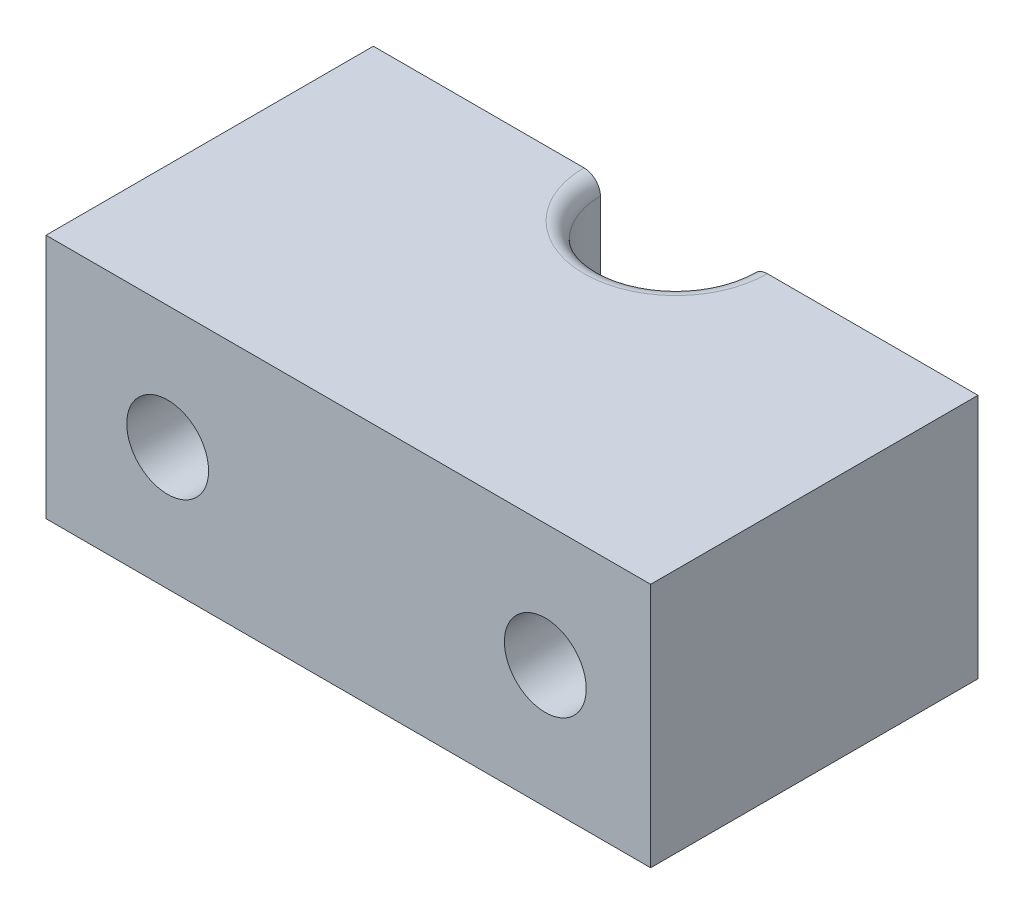
ISO-10303-21;
HEADER;
FILE_DESCRIPTION(('STEP AP214'),'2;1');
FILE_NAME('part.step','',(''),(''),'','','');
FILE_SCHEMA(('AUTOMOTIVE_DESIGN { 1 0 10303 214 1 1 1 1 }'));
ENDSEC;
DATA;
#1=APPLICATION_CONTEXT('core data for automotive mechanical design processes');
#2=APPLICATION_PROTOCOL_DEFINITION('international standard','automotive_design',2000,#1);
#3=PRODUCT_CONTEXT('',#1,'mechanical');
#4=PRODUCT('Part','Part','',(#3));
#5=PRODUCT_RELATED_PRODUCT_CATEGORY('part','',(#4));
#6=PRODUCT_DEFINITION_FORMATION('','',#4);
#7=PRODUCT_DEFINITION_CONTEXT('part definition',#1,'design');
#8=PRODUCT_DEFINITION('design','',#6,#7);
#9=PRODUCT_DEFINITION_SHAPE('','',#8);
#10=(LENGTH_UNIT() NAMED_UNIT(*) SI_UNIT(.MILLI.,.METRE.));
#11=(NAMED_UNIT(*) PLANE_ANGLE_UNIT() SI_UNIT($,.RADIAN.));
#12=(NAMED_UNIT(*) SI_UNIT($,.STERADIAN.) SOLID_ANGLE_UNIT());
#13=UNCERTAINTY_MEASURE_WITH_UNIT(LENGTH_MEASURE(1.E-05),#10,'distance_accuracy_value','');
#14=(GEOMETRIC_REPRESENTATION_CONTEXT(3) GLOBAL_UNCERTAINTY_ASSIGNED_CONTEXT((#13)) GLOBAL_UNIT_ASSIGNED_CONTEXT((#10,
#11,#12)) REPRESENTATION_CONTEXT('',''));
#15=CARTESIAN_POINT('',(0.,0.,0.));
#16=DIRECTION('',(0.,0.,1.));
#17=DIRECTION('',(1.,0.,0.));
#18=AXIS2_PLACEMENT_3D('',#15,#16,#17);
#19=CARTESIAN_POINT('',(125.,0.,-20.));
#20=DIRECTION('',(0.,0.,-1.));
#21=DIRECTION('',(-1.,0.,0.));
#22=AXIS2_PLACEMENT_3D('',#19,#20,#21);
#23=PLANE('',#22);
#24=DIRECTION('',(0.,1.,0.));
#25=VECTOR('',#24,1.);
#26=CARTESIAN_POINT('',(101.93,0.,-20.));
#27=LINE('',#26,#25);
#28=CARTESIAN_POINT('',(101.93,1.,-20.));
#29=VERTEX_POINT('',#28);
#30=CARTESIAN_POINT('',(101.93,14.,-20.));
#31=VERTEX_POINT('',#30);
#32=EDGE_CURVE('E170',#29,#31,#27,.T.);
#33=ORIENTED_EDGE('',*,*,#32,.F.);
#34=CARTESIAN_POINT('',(100.93,1.,-20.));
#35=DIRECTION('',(0.,0.,-1.));
#36=DIRECTION('',(-1.,0.,0.));
#37=AXIS2_PLACEMENT_3D('',#34,#35,#36);
#38=CIRCLE('',#37,1.);
#39=CARTESIAN_POINT('',(100.93,0.,-20.));
#40=VERTEX_POINT('',#39);
#41=EDGE_CURVE('E11',#29,#40,#38,.T.);
#42=ORIENTED_EDGE('',*,*,#41,.T.);
#43=DIRECTION('',(-1.,0.,0.));
#44=VECTOR('',#43,1.);
#45=CARTESIAN_POINT('',(125.,0.,-20.));
#46=LINE('',#45,#44);
#47=CARTESIAN_POINT('',(88.06,0.,-20.));
#48=VERTEX_POINT('',#47);
#49=EDGE_CURVE('E120',#40,#48,#46,.T.);
#50=ORIENTED_EDGE('',*,*,#49,.T.);
#51=DIRECTION('',(0.,1.,0.));
#52=VECTOR('',#51,1.);
#53=CARTESIAN_POINT('',(88.06,0.,-20.));
#54=LINE('',#53,#52);
#55=CARTESIAN_POINT('',(88.06,15.,-20.));
#56=VERTEX_POINT('',#55);
#57=EDGE_CURVE('E106',#48,#56,#54,.T.);
#58=ORIENTED_EDGE('',*,*,#57,.T.);
#59=DIRECTION('',(-1.,0.,0.));
#60=VECTOR('',#59,1.);
#61=CARTESIAN_POINT('',(125.,15.,-20.));
#62=LINE('',#61,#60);
#63=CARTESIAN_POINT('',(100.93,15.,-20.));
#64=VERTEX_POINT('',#63);
#65=EDGE_CURVE('E138',#64,#56,#62,.T.);
#66=ORIENTED_EDGE('',*,*,#65,.F.);
#67=CARTESIAN_POINT('',(100.93,14.,-20.));
#68=DIRECTION('',(0.,0.,-1.));
#69=DIRECTION('',(-1.,0.,0.));
#70=AXIS2_PLACEMENT_3D('',#67,#68,#69);
#71=CIRCLE('',#70,1.);
#72=EDGE_CURVE('E161',#64,#31,#71,.T.);
#73=ORIENTED_EDGE('',*,*,#72,.T.);
#74=EDGE_LOOP('',(#33,#42,#50,#58,#66,#73));
#75=FACE_BOUND('',#74,.T.);
#76=CARTESIAN_POINT('',(95.4916685270529,7.5,-20.));
#77=DIRECTION('',(0.,0.,-1.));
#78=DIRECTION('',(-1.,0.,0.));
#79=AXIS2_PLACEMENT_3D('',#76,#77,#78);
#80=CIRCLE('',#79,2.49999999999999);
#81=CARTESIAN_POINT('',(92.9916685270529,7.5,-20.));
#82=VERTEX_POINT('',#81);
#83=EDGE_CURVE('E139',#82,#82,#80,.T.);
#84=ORIENTED_EDGE('',*,*,#83,.F.);
#85=EDGE_LOOP('',(#84));
#86=FACE_BOUND('',#85,.T.);
#87=ADVANCED_FACE('F33',(#75,#86),#23,.T.);
#88=CARTESIAN_POINT('',(125.,0.,0.));
#89=DIRECTION('',(1.,0.,0.));
#90=DIRECTION('',(0.,0.,-1.));
#91=AXIS2_PLACEMENT_3D('',#88,#89,#90);
#92=PLANE('',#91);
#93=DIRECTION('',(0.,0.,-1.));
#94=VECTOR('',#93,1.);
#95=CARTESIAN_POINT('',(125.,15.,0.));
#96=LINE('',#95,#94);
#97=CARTESIAN_POINT('',(125.,15.,0.));
#98=VERTEX_POINT('',#97);
#99=CARTESIAN_POINT('',(125.,15.,-20.));
#100=VERTEX_POINT('',#99);
#101=EDGE_CURVE('E136',#98,#100,#96,.T.);
#102=ORIENTED_EDGE('',*,*,#101,.F.);
#103=DIRECTION('',(0.,1.,0.));
#104=VECTOR('',#103,1.);
#105=CARTESIAN_POINT('',(125.,0.,0.));
#106=LINE('',#105,#104);
#107=CARTESIAN_POINT('',(125.,0.,0.));
#108=VERTEX_POINT('',#107);
#109=EDGE_CURVE('E123',#108,#98,#106,.T.);
#110=ORIENTED_EDGE('',*,*,#109,.F.);
#111=DIRECTION('',(0.,0.,-1.));
#112=VECTOR('',#111,1.);
#113=CARTESIAN_POINT('',(125.,0.,0.));
#114=LINE('',#113,#112);
#115=CARTESIAN_POINT('',(125.,0.,-20.));
#116=VERTEX_POINT('',#115);
#117=EDGE_CURVE('E115',#108,#116,#114,.T.);
#118=ORIENTED_EDGE('',*,*,#117,.T.);
#119=DIRECTION('',(0.,1.,0.));
#120=VECTOR('',#119,1.);
#121=CARTESIAN_POINT('',(125.,0.,-20.));
#122=LINE('',#121,#120);
#123=EDGE_CURVE('E95',#116,#100,#122,.T.);
#124=ORIENTED_EDGE('',*,*,#123,.T.);
#125=EDGE_LOOP('',(#102,#110,#118,#124));
#126=FACE_BOUND('',#125,.T.);
#127=ADVANCED_FACE('F122',(#126),#92,.T.);
#128=CARTESIAN_POINT('',(125.,0.,0.));
#129=DIRECTION('',(0.,0.,1.));
#130=DIRECTION('',(1.,0.,0.));
#131=AXIS2_PLACEMENT_3D('',#128,#129,#130);
#132=PLANE('',#131);
#133=CARTESIAN_POINT('',(95.4916685270529,7.5,0.));
#134=DIRECTION('',(0.,0.,1.));
#135=DIRECTION('',(1.,0.,0.));
#136=AXIS2_PLACEMENT_3D('',#133,#134,#135);
#137=CIRCLE('',#136,2.49999999999999);
#138=CARTESIAN_POINT('',(97.9916685270529,7.5,0.));
#139=VERTEX_POINT('',#138);
#140=EDGE_CURVE('E152',#139,#139,#137,.T.);
#141=ORIENTED_EDGE('',*,*,#140,.F.);
#142=EDGE_LOOP('',(#141));
#143=FACE_BOUND('',#142,.T.);
#144=CARTESIAN_POINT('',(118.565,7.5,0.));
#145=DIRECTION('',(0.,0.,1.));
#146=DIRECTION('',(1.,0.,0.));
#147=AXIS2_PLACEMENT_3D('',#144,#145,#146);
#148=CIRCLE('',#147,2.5);
#149=CARTESIAN_POINT('',(121.065,7.5,0.));
#150=VERTEX_POINT('',#149);
#151=EDGE_CURVE('E130',#150,#150,#148,.T.);
#152=ORIENTED_EDGE('',*,*,#151,.F.);
#153=EDGE_LOOP('',(#152));
#154=FACE_BOUND('',#153,.T.);
#155=DIRECTION('',(1.,0.,0.));
#156=VECTOR('',#155,1.);
#157=CARTESIAN_POINT('',(125.,15.,0.));
#158=LINE('',#157,#156);
#159=CARTESIAN_POINT('',(88.06,15.,0.));
#160=VERTEX_POINT('',#159);
#161=EDGE_CURVE('E124',#160,#98,#158,.T.);
#162=ORIENTED_EDGE('',*,*,#161,.F.);
#163=DIRECTION('',(0.,1.,0.));
#164=VECTOR('',#163,1.);
#165=CARTESIAN_POINT('',(88.06,0.,0.));
#166=LINE('',#165,#164);
#167=CARTESIAN_POINT('',(88.06,0.,0.));
#168=VERTEX_POINT('',#167);
#169=EDGE_CURVE('E145',#168,#160,#166,.T.);
#170=ORIENTED_EDGE('',*,*,#169,.F.);
#171=DIRECTION('',(1.,0.,0.));
#172=VECTOR('',#171,1.);
#173=CARTESIAN_POINT('',(125.,0.,0.));
#174=LINE('',#173,#172);
#175=EDGE_CURVE('E107',#168,#108,#174,.T.);
#176=ORIENTED_EDGE('',*,*,#175,.T.);
#177=ORIENTED_EDGE('',*,*,#109,.T.);
#178=EDGE_LOOP('',(#162,#170,#176,#177));
#179=FACE_BOUND('',#178,.T.);
#180=ADVANCED_FACE('F187',(#143,#154,#179),#132,.T.);
#181=CARTESIAN_POINT('',(88.06,0.,0.));
#182=DIRECTION('',(-1.,0.,0.));
#183=DIRECTION('',(0.,0.,1.));
#184=AXIS2_PLACEMENT_3D('',#181,#182,#183);
#185=PLANE('',#184);
#186=DIRECTION('',(0.,0.,1.));
#187=VECTOR('',#186,1.);
#188=CARTESIAN_POINT('',(88.06,15.,0.));
#189=LINE('',#188,#187);
#190=EDGE_CURVE('E127',#56,#160,#189,.T.);
#191=ORIENTED_EDGE('',*,*,#190,.F.);
#192=ORIENTED_EDGE('',*,*,#57,.F.);
#193=DIRECTION('',(0.,0.,1.));
#194=VECTOR('',#193,1.);
#195=CARTESIAN_POINT('',(88.06,0.,0.));
#196=LINE('',#195,#194);
#197=EDGE_CURVE('E119',#48,#168,#196,.T.);
#198=ORIENTED_EDGE('',*,*,#197,.T.);
#199=ORIENTED_EDGE('',*,*,#169,.T.);
#200=EDGE_LOOP('',(#191,#192,#198,#199));
#201=FACE_BOUND('',#200,.T.);
#202=ADVANCED_FACE('F190',(#201),#185,.T.);
#203=CARTESIAN_POINT('',(112.13,0.,-20.));
#204=VERTEX_POINT('',#203);
#205=EDGE_CURVE('E99',#116,#204,#46,.T.);
#206=ORIENTED_EDGE('',*,*,#205,.T.);
#207=CARTESIAN_POINT('',(112.13,1.,-20.));
#208=DIRECTION('',(0.,0.,-1.));
#209=DIRECTION('',(-1.,0.,0.));
#210=AXIS2_PLACEMENT_3D('',#207,#208,#209);
#211=CIRCLE('',#210,1.);
#212=CARTESIAN_POINT('',(111.13,1.,-20.));
#213=VERTEX_POINT('',#212);
#214=EDGE_CURVE('E55',#204,#213,#211,.T.);
#215=ORIENTED_EDGE('',*,*,#214,.T.);
#216=DIRECTION('',(0.,1.,0.));
#217=VECTOR('',#216,1.);
#218=CARTESIAN_POINT('',(111.13,0.,-20.));
#219=LINE('',#218,#217);
#220=CARTESIAN_POINT('',(111.13,14.,-20.));
#221=VERTEX_POINT('',#220);
#222=EDGE_CURVE('E176',#221,#213,#219,.F.);
#223=ORIENTED_EDGE('',*,*,#222,.F.);
#224=CARTESIAN_POINT('',(112.13,14.,-20.));
#225=DIRECTION('',(0.,0.,-1.));
#226=DIRECTION('',(-1.,0.,0.));
#227=AXIS2_PLACEMENT_3D('',#224,#225,#226);
#228=CIRCLE('',#227,1.);
#229=CARTESIAN_POINT('',(112.13,15.,-20.));
#230=VERTEX_POINT('',#229);
#231=EDGE_CURVE('E157',#221,#230,#228,.T.);
#232=ORIENTED_EDGE('',*,*,#231,.T.);
#233=EDGE_CURVE('E101',#100,#230,#62,.T.);
#234=ORIENTED_EDGE('',*,*,#233,.F.);
#235=ORIENTED_EDGE('',*,*,#123,.F.);
#236=EDGE_LOOP('',(#206,#215,#223,#232,#234,#235));
#237=FACE_BOUND('',#236,.T.);
#238=CARTESIAN_POINT('',(118.565,7.5,-20.));
#239=DIRECTION('',(0.,0.,-1.));
#240=DIRECTION('',(-1.,0.,0.));
#241=AXIS2_PLACEMENT_3D('',#238,#239,#240);
#242=CIRCLE('',#241,2.5);
#243=CARTESIAN_POINT('',(116.065,7.5,-20.));
#244=VERTEX_POINT('',#243);
#245=EDGE_CURVE('E149',#244,#244,#242,.T.);
#246=ORIENTED_EDGE('',*,*,#245,.F.);
#247=EDGE_LOOP('',(#246));
#248=FACE_BOUND('',#247,.T.);
#249=ADVANCED_FACE('F97',(#237,#248),#23,.T.);
#250=CARTESIAN_POINT('',(0.,0.,0.));
#251=DIRECTION('',(0.,1.,0.));
#252=DIRECTION('',(0.,0.,1.));
#253=AXIS2_PLACEMENT_3D('',#250,#251,#252);
#254=PLANE('',#253);
#255=ORIENTED_EDGE('',*,*,#49,.F.);
#256=CARTESIAN_POINT('',(106.53,0.,-20.));
#257=DIRECTION('',(0.,1.,0.));
#258=DIRECTION('',(0.,0.,1.));
#259=AXIS2_PLACEMENT_3D('',#256,#257,#258);
#260=CIRCLE('',#259,5.60000000000001);
#261=EDGE_CURVE('E118',#40,#204,#260,.T.);
#262=ORIENTED_EDGE('',*,*,#261,.T.);
#263=ORIENTED_EDGE('',*,*,#205,.F.);
#264=ORIENTED_EDGE('',*,*,#117,.F.);
#265=ORIENTED_EDGE('',*,*,#175,.F.);
#266=ORIENTED_EDGE('',*,*,#197,.F.);
#267=EDGE_LOOP('',(#255,#262,#263,#264,#265,#266));
#268=FACE_BOUND('',#267,.T.);
#269=ADVANCED_FACE('F113',(#268),#254,.F.);
#270=CARTESIAN_POINT('',(0.,15.,0.));
#271=DIRECTION('',(0.,1.,0.));
#272=DIRECTION('',(0.,0.,1.));
#273=AXIS2_PLACEMENT_3D('',#270,#271,#272);
#274=PLANE('',#273);
#275=ORIENTED_EDGE('',*,*,#233,.T.);
#276=CARTESIAN_POINT('',(106.53,15.,-20.));
#277=DIRECTION('',(0.,1.,0.));
#278=DIRECTION('',(0.,0.,1.));
#279=AXIS2_PLACEMENT_3D('',#276,#277,#278);
#280=CIRCLE('',#279,5.60000000000001);
#281=EDGE_CURVE('E159',#230,#64,#280,.F.);
#282=ORIENTED_EDGE('',*,*,#281,.T.);
#283=ORIENTED_EDGE('',*,*,#65,.T.);
#284=ORIENTED_EDGE('',*,*,#190,.T.);
#285=ORIENTED_EDGE('',*,*,#161,.T.);
#286=ORIENTED_EDGE('',*,*,#101,.T.);
#287=EDGE_LOOP('',(#275,#282,#283,#284,#285,#286));
#288=FACE_BOUND('',#287,.T.);
#289=ADVANCED_FACE('F195',(#288),#274,.T.);
#290=CARTESIAN_POINT('',(118.565,7.5,-40.));
#291=DIRECTION('',(0.,0.,1.));
#292=DIRECTION('',(1.,0.,0.));
#293=AXIS2_PLACEMENT_3D('',#290,#291,#292);
#294=CYLINDRICAL_SURFACE('',#293,2.5);
#295=ORIENTED_EDGE('',*,*,#245,.T.);
#296=EDGE_LOOP('',(#295));
#297=FACE_BOUND('',#296,.T.);
#298=ORIENTED_EDGE('',*,*,#151,.T.);
#299=EDGE_LOOP('',(#298));
#300=FACE_BOUND('',#299,.T.);
#301=ADVANCED_FACE('F185',(#297,#300),#294,.F.);
#302=CARTESIAN_POINT('',(95.4916685270529,7.5,-40.));
#303=DIRECTION('',(0.,0.,1.));
#304=DIRECTION('',(1.,0.,0.));
#305=AXIS2_PLACEMENT_3D('',#302,#303,#304);
#306=CYLINDRICAL_SURFACE('',#305,2.49999999999999);
#307=ORIENTED_EDGE('',*,*,#83,.T.);
#308=EDGE_LOOP('',(#307));
#309=FACE_BOUND('',#308,.T.);
#310=ORIENTED_EDGE('',*,*,#140,.T.);
#311=EDGE_LOOP('',(#310));
#312=FACE_BOUND('',#311,.T.);
#313=ADVANCED_FACE('F226',(#309,#312),#306,.F.);
#314=CARTESIAN_POINT('',(106.53,0.,-20.));
#315=DIRECTION('',(0.,1.,0.));
#316=DIRECTION('',(0.,0.,1.));
#317=AXIS2_PLACEMENT_3D('',#314,#315,#316);
#318=CYLINDRICAL_SURFACE('',#317,4.60000000000001);
#319=ORIENTED_EDGE('',*,*,#222,.T.);
#320=CARTESIAN_POINT('',(106.53,1.,-20.));
#321=DIRECTION('',(0.,1.,0.));
#322=DIRECTION('',(0.,0.,1.));
#323=AXIS2_PLACEMENT_3D('',#320,#321,#322);
#324=CIRCLE('',#323,4.60000000000001);
#325=EDGE_CURVE('E41',#213,#29,#324,.F.);
#326=ORIENTED_EDGE('',*,*,#325,.T.);
#327=ORIENTED_EDGE('',*,*,#32,.T.);
#328=CARTESIAN_POINT('',(106.53,14.,-20.));
#329=DIRECTION('',(0.,1.,0.));
#330=DIRECTION('',(0.,0.,1.));
#331=AXIS2_PLACEMENT_3D('',#328,#329,#330);
#332=CIRCLE('',#331,4.60000000000001);
#333=EDGE_CURVE('E144',#31,#221,#332,.T.);
#334=ORIENTED_EDGE('',*,*,#333,.T.);
#335=EDGE_LOOP('',(#319,#326,#327,#334));
#336=FACE_BOUND('',#335,.T.);
#337=ADVANCED_FACE('F175',(#336),#318,.F.);
#338=CARTESIAN_POINT('',(106.53,14.,-20.));
#339=DIRECTION('',(0.,1.,0.));
#340=DIRECTION('',(0.,0.,1.));
#341=AXIS2_PLACEMENT_3D('',#338,#339,#340);
#342=TOROIDAL_SURFACE('',#341,5.60000000000001,1.);
#343=ORIENTED_EDGE('',*,*,#72,.F.);
#344=ORIENTED_EDGE('',*,*,#281,.F.);
#345=ORIENTED_EDGE('',*,*,#231,.F.);
#346=ORIENTED_EDGE('',*,*,#333,.F.);
#347=EDGE_LOOP('',(#343,#344,#345,#346));
#348=FACE_BOUND('',#347,.T.);
#349=ADVANCED_FACE('F174',(#348),#342,.T.);
#350=CARTESIAN_POINT('',(106.53,1.,-20.));
#351=DIRECTION('',(0.,1.,0.));
#352=DIRECTION('',(0.,0.,1.));
#353=AXIS2_PLACEMENT_3D('',#350,#351,#352);
#354=TOROIDAL_SURFACE('',#353,5.60000000000001,1.);
#355=ORIENTED_EDGE('',*,*,#41,.F.);
#356=ORIENTED_EDGE('',*,*,#325,.F.);
#357=ORIENTED_EDGE('',*,*,#214,.F.);
#358=ORIENTED_EDGE('',*,*,#261,.F.);
#359=EDGE_LOOP('',(#355,#356,#357,#358));
#360=FACE_BOUND('',#359,.T.);
#361=ADVANCED_FACE('F35',(#360),#354,.T.);
#362=CLOSED_SHELL('',(#87,#127,#180,#202,#249,#269,#289,#301,#313,#337,#349,#361));
#363=MANIFOLD_SOLID_BREP('B2',#362);
#364=ADVANCED_BREP_SHAPE_REPRESENTATION('',(#18,#363),#14);
#365=SHAPE_DEFINITION_REPRESENTATION(#9,#364);
ENDSEC;
END-ISO-10303-21;
